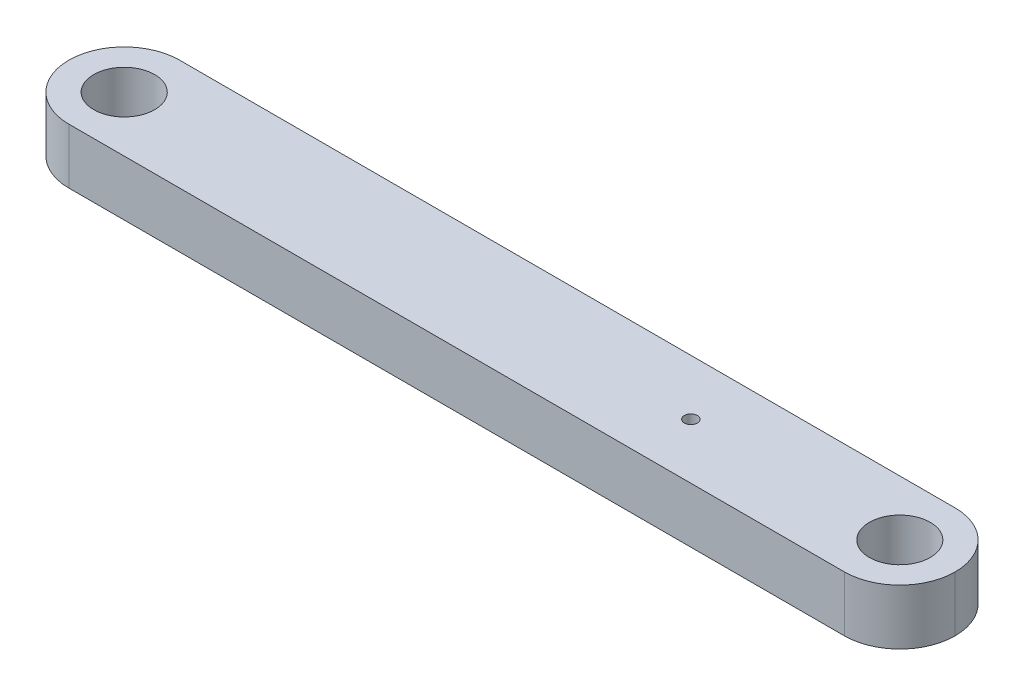
ISO-10303-21;
HEADER;
FILE_DESCRIPTION(('STEP AP214'),'2;1');
FILE_NAME('part.step','',(''),(''),'','','');
FILE_SCHEMA(('AUTOMOTIVE_DESIGN { 1 0 10303 214 1 1 1 1 }'));
ENDSEC;
DATA;
#1=APPLICATION_CONTEXT('core data for automotive mechanical design processes');
#2=APPLICATION_PROTOCOL_DEFINITION('international standard','automotive_design',2000,#1);
#3=PRODUCT_CONTEXT('',#1,'mechanical');
#4=PRODUCT('Part','Part','',(#3));
#5=PRODUCT_RELATED_PRODUCT_CATEGORY('part','',(#4));
#6=PRODUCT_DEFINITION_FORMATION('','',#4);
#7=PRODUCT_DEFINITION_CONTEXT('part definition',#1,'design');
#8=PRODUCT_DEFINITION('design','',#6,#7);
#9=PRODUCT_DEFINITION_SHAPE('','',#8);
#10=(LENGTH_UNIT() NAMED_UNIT(*) SI_UNIT(.MILLI.,.METRE.));
#11=(NAMED_UNIT(*) PLANE_ANGLE_UNIT() SI_UNIT($,.RADIAN.));
#12=(NAMED_UNIT(*) SI_UNIT($,.STERADIAN.) SOLID_ANGLE_UNIT());
#13=UNCERTAINTY_MEASURE_WITH_UNIT(LENGTH_MEASURE(1.E-05),#10,'distance_accuracy_value','');
#14=(GEOMETRIC_REPRESENTATION_CONTEXT(3) GLOBAL_UNCERTAINTY_ASSIGNED_CONTEXT((#13)) GLOBAL_UNIT_ASSIGNED_CONTEXT((#10,
#11,#12)) REPRESENTATION_CONTEXT('',''));
#15=CARTESIAN_POINT('',(0.,0.,0.));
#16=DIRECTION('',(0.,0.,1.));
#17=DIRECTION('',(1.,0.,0.));
#18=AXIS2_PLACEMENT_3D('',#15,#16,#17);
#19=CARTESIAN_POINT('',(0.,6.35,6.35000000000002));
#20=DIRECTION('',(0.,0.,-1.));
#21=DIRECTION('',(-1.,0.,0.));
#22=AXIS2_PLACEMENT_3D('',#19,#20,#21);
#23=PLANE('',#22);
#24=DIRECTION('',(1.,0.,0.));
#25=VECTOR('',#24,1.);
#26=CARTESIAN_POINT('',(0.,6.35,6.35000000000002));
#27=LINE('',#26,#25);
#28=CARTESIAN_POINT('',(-44.45,6.35,6.35000000000001));
#29=VERTEX_POINT('',#28);
#30=CARTESIAN_POINT('',(44.45,6.35,6.35000000000003));
#31=VERTEX_POINT('',#30);
#32=EDGE_CURVE('E122',#29,#31,#27,.T.);
#33=ORIENTED_EDGE('',*,*,#32,.F.);
#34=DIRECTION('',(0.,-1.,0.));
#35=VECTOR('',#34,1.);
#36=CARTESIAN_POINT('',(-44.45,0.,6.35000000000001));
#37=LINE('',#36,#35);
#38=CARTESIAN_POINT('',(-44.45,0.,6.35000000000001));
#39=VERTEX_POINT('',#38);
#40=EDGE_CURVE('E106',#29,#39,#37,.T.);
#41=ORIENTED_EDGE('',*,*,#40,.T.);
#42=DIRECTION('',(1.,0.,0.));
#43=VECTOR('',#42,1.);
#44=CARTESIAN_POINT('',(0.,0.,6.35000000000002));
#45=LINE('',#44,#43);
#46=CARTESIAN_POINT('',(44.45,0.,6.35000000000003));
#47=VERTEX_POINT('',#46);
#48=EDGE_CURVE('E119',#39,#47,#45,.T.);
#49=ORIENTED_EDGE('',*,*,#48,.T.);
#50=DIRECTION('',(0.,-1.,0.));
#51=VECTOR('',#50,1.);
#52=CARTESIAN_POINT('',(44.45,6.35,6.35000000000003));
#53=LINE('',#52,#51);
#54=EDGE_CURVE('E124',#47,#31,#53,.F.);
#55=ORIENTED_EDGE('',*,*,#54,.T.);
#56=EDGE_LOOP('',(#33,#41,#49,#55));
#57=FACE_BOUND('',#56,.T.);
#58=ADVANCED_FACE('F47',(#57),#23,.F.);
#59=CARTESIAN_POINT('',(0.,6.35,-6.34999999999999));
#60=DIRECTION('',(0.,0.,-1.));
#61=DIRECTION('',(-1.,0.,0.));
#62=AXIS2_PLACEMENT_3D('',#59,#60,#61);
#63=PLANE('',#62);
#64=DIRECTION('',(1.,0.,0.));
#65=VECTOR('',#64,1.);
#66=CARTESIAN_POINT('',(0.,6.35,-6.34999999999999));
#67=LINE('',#66,#65);
#68=CARTESIAN_POINT('',(-44.45,6.35,-6.34999999999999));
#69=VERTEX_POINT('',#68);
#70=CARTESIAN_POINT('',(44.45,6.35,-6.35));
#71=VERTEX_POINT('',#70);
#72=EDGE_CURVE('E172',#69,#71,#67,.T.);
#73=ORIENTED_EDGE('',*,*,#72,.T.);
#74=DIRECTION('',(0.,-1.,0.));
#75=VECTOR('',#74,1.);
#76=CARTESIAN_POINT('',(44.45,0.,-6.35));
#77=LINE('',#76,#75);
#78=CARTESIAN_POINT('',(44.45,0.,-6.35));
#79=VERTEX_POINT('',#78);
#80=EDGE_CURVE('E11',#71,#79,#77,.T.);
#81=ORIENTED_EDGE('',*,*,#80,.T.);
#82=DIRECTION('',(1.,0.,0.));
#83=VECTOR('',#82,1.);
#84=CARTESIAN_POINT('',(0.,0.,-6.34999999999999));
#85=LINE('',#84,#83);
#86=CARTESIAN_POINT('',(-44.45,0.,-6.34999999999999));
#87=VERTEX_POINT('',#86);
#88=EDGE_CURVE('E131',#87,#79,#85,.T.);
#89=ORIENTED_EDGE('',*,*,#88,.F.);
#90=DIRECTION('',(0.,-1.,0.));
#91=VECTOR('',#90,1.);
#92=CARTESIAN_POINT('',(-44.45,6.35,-6.34999999999999));
#93=LINE('',#92,#91);
#94=EDGE_CURVE('E57',#87,#69,#93,.F.);
#95=ORIENTED_EDGE('',*,*,#94,.T.);
#96=EDGE_LOOP('',(#73,#81,#89,#95));
#97=FACE_BOUND('',#96,.T.);
#98=ADVANCED_FACE('F171',(#97),#63,.T.);
#99=CARTESIAN_POINT('',(-44.45,6.35,0.));
#100=DIRECTION('',(0.,-1.,0.));
#101=DIRECTION('',(0.,0.,-1.));
#102=AXIS2_PLACEMENT_3D('',#99,#100,#101);
#103=CYLINDRICAL_SURFACE('',#102,3.49249999999999);
#104=CARTESIAN_POINT('',(-44.45,6.35,0.));
#105=DIRECTION('',(0.,1.,0.));
#106=DIRECTION('',(0.,0.,1.));
#107=AXIS2_PLACEMENT_3D('',#104,#105,#106);
#108=CIRCLE('',#107,3.49249999999999);
#109=CARTESIAN_POINT('',(-44.45,6.35,3.49249999999999));
#110=VERTEX_POINT('',#109);
#111=EDGE_CURVE('E178',#110,#110,#108,.T.);
#112=ORIENTED_EDGE('',*,*,#111,.T.);
#113=EDGE_LOOP('',(#112));
#114=FACE_BOUND('',#113,.T.);
#115=CARTESIAN_POINT('',(-44.45,0.,0.));
#116=DIRECTION('',(0.,1.,0.));
#117=DIRECTION('',(0.,0.,1.));
#118=AXIS2_PLACEMENT_3D('',#115,#116,#117);
#119=CIRCLE('',#118,3.49249999999999);
#120=CARTESIAN_POINT('',(-44.45,0.,3.49249999999999));
#121=VERTEX_POINT('',#120);
#122=EDGE_CURVE('E136',#121,#121,#119,.T.);
#123=ORIENTED_EDGE('',*,*,#122,.F.);
#124=EDGE_LOOP('',(#123));
#125=FACE_BOUND('',#124,.T.);
#126=ADVANCED_FACE('F198',(#114,#125),#103,.F.);
#127=CARTESIAN_POINT('',(44.45,6.35,0.));
#128=DIRECTION('',(0.,-1.,0.));
#129=DIRECTION('',(0.,0.,-1.));
#130=AXIS2_PLACEMENT_3D('',#127,#128,#129);
#131=CYLINDRICAL_SURFACE('',#130,3.49249999999999);
#132=CARTESIAN_POINT('',(44.45,6.35,0.));
#133=DIRECTION('',(0.,1.,0.));
#134=DIRECTION('',(0.,0.,1.));
#135=AXIS2_PLACEMENT_3D('',#132,#133,#134);
#136=CIRCLE('',#135,3.49249999999999);
#137=CARTESIAN_POINT('',(44.45,6.35,3.49249999999998));
#138=VERTEX_POINT('',#137);
#139=EDGE_CURVE('E139',#138,#138,#136,.F.);
#140=ORIENTED_EDGE('',*,*,#139,.F.);
#141=EDGE_LOOP('',(#140));
#142=FACE_BOUND('',#141,.T.);
#143=CARTESIAN_POINT('',(44.45,0.,0.));
#144=DIRECTION('',(0.,1.,0.));
#145=DIRECTION('',(0.,0.,1.));
#146=AXIS2_PLACEMENT_3D('',#143,#144,#145);
#147=CIRCLE('',#146,3.49249999999999);
#148=CARTESIAN_POINT('',(44.45,0.,3.49249999999998));
#149=VERTEX_POINT('',#148);
#150=EDGE_CURVE('E145',#149,#149,#147,.F.);
#151=ORIENTED_EDGE('',*,*,#150,.T.);
#152=EDGE_LOOP('',(#151));
#153=FACE_BOUND('',#152,.T.);
#154=ADVANCED_FACE('F195',(#142,#153),#131,.F.);
#155=CARTESIAN_POINT('',(0.,6.35,0.));
#156=DIRECTION('',(0.,1.,0.));
#157=DIRECTION('',(0.,0.,1.));
#158=AXIS2_PLACEMENT_3D('',#155,#156,#157);
#159=PLANE('',#158);
#160=CARTESIAN_POINT('',(20.5,6.35,0.));
#161=DIRECTION('',(0.,1.,0.));
#162=DIRECTION('',(0.,0.,1.));
#163=AXIS2_PLACEMENT_3D('',#160,#161,#162);
#164=CIRCLE('',#163,0.750000000000002);
#165=CARTESIAN_POINT('',(20.5,6.35,0.749999999999998));
#166=VERTEX_POINT('',#165);
#167=EDGE_CURVE('E184',#166,#166,#164,.T.);
#168=ORIENTED_EDGE('',*,*,#167,.F.);
#169=EDGE_LOOP('',(#168));
#170=FACE_BOUND('',#169,.T.);
#171=ORIENTED_EDGE('',*,*,#32,.T.);
#172=CARTESIAN_POINT('',(44.45,6.35,0.));
#173=DIRECTION('',(0.,1.,0.));
#174=DIRECTION('',(0.,0.,1.));
#175=AXIS2_PLACEMENT_3D('',#172,#173,#174);
#176=CIRCLE('',#175,6.35);
#177=CARTESIAN_POINT('',(50.8,6.35,0.));
#178=VERTEX_POINT('',#177);
#179=EDGE_CURVE('E164',#31,#178,#176,.T.);
#180=ORIENTED_EDGE('',*,*,#179,.T.);
#181=CARTESIAN_POINT('',(44.45,6.35,0.));
#182=DIRECTION('',(0.,1.,0.));
#183=DIRECTION('',(0.,0.,1.));
#184=AXIS2_PLACEMENT_3D('',#181,#182,#183);
#185=CIRCLE('',#184,6.35);
#186=EDGE_CURVE('E71',#178,#71,#185,.T.);
#187=ORIENTED_EDGE('',*,*,#186,.T.);
#188=ORIENTED_EDGE('',*,*,#72,.F.);
#189=CARTESIAN_POINT('',(-44.45,6.35,0.));
#190=DIRECTION('',(0.,1.,0.));
#191=DIRECTION('',(0.,0.,1.));
#192=AXIS2_PLACEMENT_3D('',#189,#190,#191);
#193=CIRCLE('',#192,6.35);
#194=CARTESIAN_POINT('',(-50.8,6.35,0.));
#195=VERTEX_POINT('',#194);
#196=EDGE_CURVE('E65',#69,#195,#193,.T.);
#197=ORIENTED_EDGE('',*,*,#196,.T.);
#198=CARTESIAN_POINT('',(-44.45,6.35,0.));
#199=DIRECTION('',(0.,1.,0.));
#200=DIRECTION('',(0.,0.,1.));
#201=AXIS2_PLACEMENT_3D('',#198,#199,#200);
#202=CIRCLE('',#201,6.35);
#203=EDGE_CURVE('E159',#195,#29,#202,.T.);
#204=ORIENTED_EDGE('',*,*,#203,.T.);
#205=EDGE_LOOP('',(#171,#180,#187,#188,#197,#204));
#206=FACE_BOUND('',#205,.T.);
#207=ORIENTED_EDGE('',*,*,#111,.F.);
#208=EDGE_LOOP('',(#207));
#209=FACE_BOUND('',#208,.T.);
#210=ORIENTED_EDGE('',*,*,#139,.T.);
#211=EDGE_LOOP('',(#210));
#212=FACE_BOUND('',#211,.T.);
#213=ADVANCED_FACE('F175',(#170,#206,#209,#212),#159,.T.);
#214=CARTESIAN_POINT('',(0.,0.,0.));
#215=DIRECTION('',(0.,1.,0.));
#216=DIRECTION('',(0.,0.,1.));
#217=AXIS2_PLACEMENT_3D('',#214,#215,#216);
#218=PLANE('',#217);
#219=CARTESIAN_POINT('',(20.5,0.,0.));
#220=DIRECTION('',(0.,1.,0.));
#221=DIRECTION('',(0.,0.,1.));
#222=AXIS2_PLACEMENT_3D('',#219,#220,#221);
#223=CIRCLE('',#222,0.750000000000002);
#224=CARTESIAN_POINT('',(20.5,0.,0.749999999999998));
#225=VERTEX_POINT('',#224);
#226=EDGE_CURVE('E237',#225,#225,#223,.T.);
#227=ORIENTED_EDGE('',*,*,#226,.T.);
#228=EDGE_LOOP('',(#227));
#229=FACE_BOUND('',#228,.T.);
#230=CARTESIAN_POINT('',(44.45,0.,0.));
#231=DIRECTION('',(0.,1.,0.));
#232=DIRECTION('',(0.,0.,1.));
#233=AXIS2_PLACEMENT_3D('',#230,#231,#232);
#234=CIRCLE('',#233,6.35);
#235=CARTESIAN_POINT('',(50.8,0.,0.));
#236=VERTEX_POINT('',#235);
#237=EDGE_CURVE('E112',#79,#236,#234,.F.);
#238=ORIENTED_EDGE('',*,*,#237,.T.);
#239=CARTESIAN_POINT('',(44.45,0.,0.));
#240=DIRECTION('',(0.,1.,0.));
#241=DIRECTION('',(0.,0.,1.));
#242=AXIS2_PLACEMENT_3D('',#239,#240,#241);
#243=CIRCLE('',#242,6.35);
#244=EDGE_CURVE('E129',#236,#47,#243,.F.);
#245=ORIENTED_EDGE('',*,*,#244,.T.);
#246=ORIENTED_EDGE('',*,*,#48,.F.);
#247=CARTESIAN_POINT('',(-44.45,0.,0.));
#248=DIRECTION('',(0.,1.,0.));
#249=DIRECTION('',(0.,0.,1.));
#250=AXIS2_PLACEMENT_3D('',#247,#248,#249);
#251=CIRCLE('',#250,6.35);
#252=CARTESIAN_POINT('',(-50.8,0.,0.));
#253=VERTEX_POINT('',#252);
#254=EDGE_CURVE('E102',#39,#253,#251,.F.);
#255=ORIENTED_EDGE('',*,*,#254,.T.);
#256=CARTESIAN_POINT('',(-44.45,0.,0.));
#257=DIRECTION('',(0.,1.,0.));
#258=DIRECTION('',(0.,0.,1.));
#259=AXIS2_PLACEMENT_3D('',#256,#257,#258);
#260=CIRCLE('',#259,6.35);
#261=EDGE_CURVE('E113',#253,#87,#260,.F.);
#262=ORIENTED_EDGE('',*,*,#261,.T.);
#263=ORIENTED_EDGE('',*,*,#88,.T.);
#264=EDGE_LOOP('',(#238,#245,#246,#255,#262,#263));
#265=FACE_BOUND('',#264,.T.);
#266=ORIENTED_EDGE('',*,*,#122,.T.);
#267=EDGE_LOOP('',(#266));
#268=FACE_BOUND('',#267,.T.);
#269=ORIENTED_EDGE('',*,*,#150,.F.);
#270=EDGE_LOOP('',(#269));
#271=FACE_BOUND('',#270,.T.);
#272=ADVANCED_FACE('F126',(#229,#265,#268,#271),#218,.F.);
#273=CARTESIAN_POINT('',(-44.45,6.35,0.));
#274=DIRECTION('',(0.,-1.,0.));
#275=DIRECTION('',(0.,0.,-1.));
#276=AXIS2_PLACEMENT_3D('',#273,#274,#275);
#277=CYLINDRICAL_SURFACE('',#276,6.35);
#278=DIRECTION('',(0.,-1.,0.));
#279=VECTOR('',#278,1.);
#280=CARTESIAN_POINT('',(-50.8,6.35,0.));
#281=LINE('',#280,#279);
#282=EDGE_CURVE('E107',#195,#253,#281,.T.);
#283=ORIENTED_EDGE('',*,*,#282,.F.);
#284=ORIENTED_EDGE('',*,*,#196,.F.);
#285=ORIENTED_EDGE('',*,*,#94,.F.);
#286=ORIENTED_EDGE('',*,*,#261,.F.);
#287=EDGE_LOOP('',(#283,#284,#285,#286));
#288=FACE_BOUND('',#287,.T.);
#289=ADVANCED_FACE('F180',(#288),#277,.T.);
#290=CARTESIAN_POINT('',(-44.45,6.35,0.));
#291=DIRECTION('',(0.,1.,0.));
#292=DIRECTION('',(0.,0.,1.));
#293=AXIS2_PLACEMENT_3D('',#290,#291,#292);
#294=CYLINDRICAL_SURFACE('',#293,6.35);
#295=ORIENTED_EDGE('',*,*,#203,.F.);
#296=ORIENTED_EDGE('',*,*,#282,.T.);
#297=ORIENTED_EDGE('',*,*,#254,.F.);
#298=ORIENTED_EDGE('',*,*,#40,.F.);
#299=EDGE_LOOP('',(#295,#296,#297,#298));
#300=FACE_BOUND('',#299,.T.);
#301=ADVANCED_FACE('F105',(#300),#294,.T.);
#302=CARTESIAN_POINT('',(44.45,6.35,0.));
#303=DIRECTION('',(0.,1.,0.));
#304=DIRECTION('',(0.,0.,1.));
#305=AXIS2_PLACEMENT_3D('',#302,#303,#304);
#306=CYLINDRICAL_SURFACE('',#305,6.35);
#307=ORIENTED_EDGE('',*,*,#80,.F.);
#308=ORIENTED_EDGE('',*,*,#186,.F.);
#309=DIRECTION('',(0.,-1.,0.));
#310=VECTOR('',#309,1.);
#311=CARTESIAN_POINT('',(50.8,6.35,0.));
#312=LINE('',#311,#310);
#313=EDGE_CURVE('E51',#236,#178,#312,.F.);
#314=ORIENTED_EDGE('',*,*,#313,.F.);
#315=ORIENTED_EDGE('',*,*,#237,.F.);
#316=EDGE_LOOP('',(#307,#308,#314,#315));
#317=FACE_BOUND('',#316,.T.);
#318=ADVANCED_FACE('F49',(#317),#306,.T.);
#319=CARTESIAN_POINT('',(44.45,6.35,0.));
#320=DIRECTION('',(0.,-1.,0.));
#321=DIRECTION('',(0.,0.,-1.));
#322=AXIS2_PLACEMENT_3D('',#319,#320,#321);
#323=CYLINDRICAL_SURFACE('',#322,6.35);
#324=ORIENTED_EDGE('',*,*,#179,.F.);
#325=ORIENTED_EDGE('',*,*,#54,.F.);
#326=ORIENTED_EDGE('',*,*,#244,.F.);
#327=ORIENTED_EDGE('',*,*,#313,.T.);
#328=EDGE_LOOP('',(#324,#325,#326,#327));
#329=FACE_BOUND('',#328,.T.);
#330=ADVANCED_FACE('F223',(#329),#323,.T.);
#331=CARTESIAN_POINT('',(20.5,0.,0.));
#332=DIRECTION('',(0.,1.,0.));
#333=DIRECTION('',(0.,0.,1.));
#334=AXIS2_PLACEMENT_3D('',#331,#332,#333);
#335=CYLINDRICAL_SURFACE('',#334,0.750000000000002);
#336=ORIENTED_EDGE('',*,*,#226,.F.);
#337=EDGE_LOOP('',(#336));
#338=FACE_BOUND('',#337,.T.);
#339=ORIENTED_EDGE('',*,*,#167,.T.);
#340=EDGE_LOOP('',(#339));
#341=FACE_BOUND('',#340,.T.);
#342=ADVANCED_FACE('F225',(#338,#341),#335,.F.);
#343=CLOSED_SHELL('',(#58,#98,#126,#154,#213,#272,#289,#301,#318,#330,#342));
#344=MANIFOLD_SOLID_BREP('B2',#343);
#345=ADVANCED_BREP_SHAPE_REPRESENTATION('',(#18,#344),#14);
#346=SHAPE_DEFINITION_REPRESENTATION(#9,#345);
ENDSEC;
END-ISO-10303-21;
